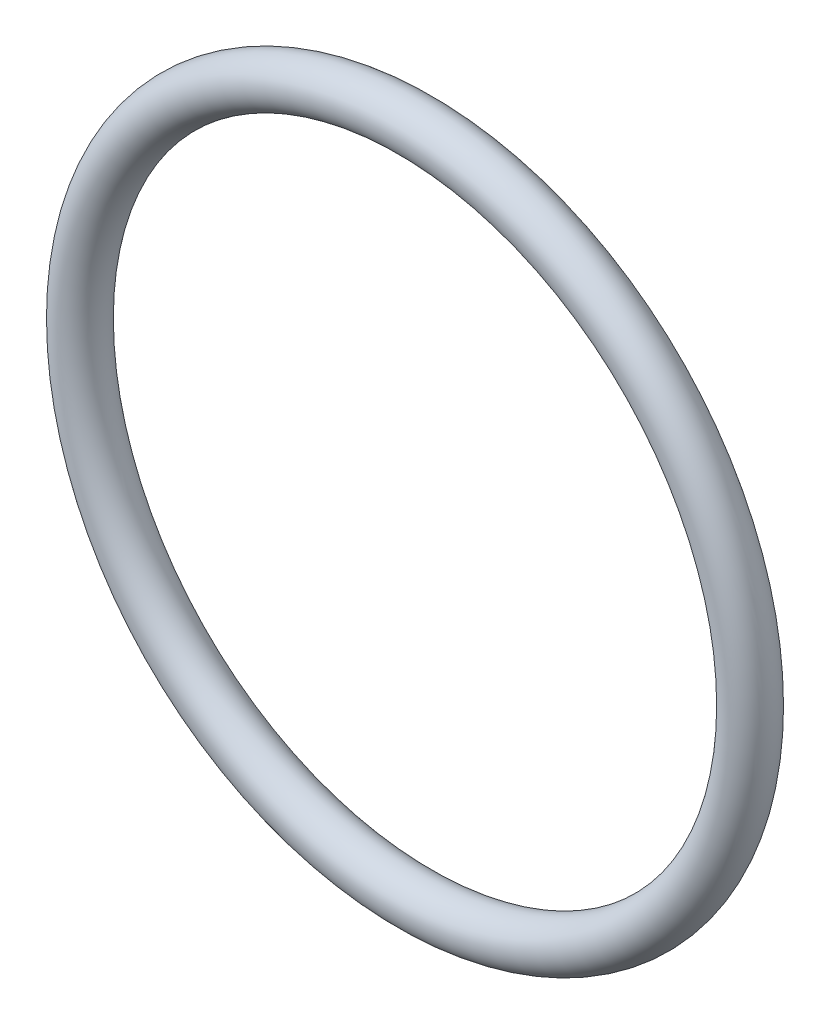
ISO-10303-21;
HEADER;
FILE_DESCRIPTION(('STEP AP214'),'2;1');
FILE_NAME('part.step','',(''),(''),'','','');
FILE_SCHEMA(('AUTOMOTIVE_DESIGN { 1 0 10303 214 1 1 1 1 }'));
ENDSEC;
DATA;
#1=APPLICATION_CONTEXT('core data for automotive mechanical design processes');
#2=APPLICATION_PROTOCOL_DEFINITION('international standard','automotive_design',2000,#1);
#3=PRODUCT_CONTEXT('',#1,'mechanical');
#4=PRODUCT('Part','Part','',(#3));
#5=PRODUCT_RELATED_PRODUCT_CATEGORY('part','',(#4));
#6=PRODUCT_DEFINITION_FORMATION('','',#4);
#7=PRODUCT_DEFINITION_CONTEXT('part definition',#1,'design');
#8=PRODUCT_DEFINITION('design','',#6,#7);
#9=PRODUCT_DEFINITION_SHAPE('','',#8);
#10=(LENGTH_UNIT() NAMED_UNIT(*) SI_UNIT(.MILLI.,.METRE.));
#11=(NAMED_UNIT(*) PLANE_ANGLE_UNIT() SI_UNIT($,.RADIAN.));
#12=(NAMED_UNIT(*) SI_UNIT($,.STERADIAN.) SOLID_ANGLE_UNIT());
#13=UNCERTAINTY_MEASURE_WITH_UNIT(LENGTH_MEASURE(1.E-05),#10,'distance_accuracy_value','');
#14=(GEOMETRIC_REPRESENTATION_CONTEXT(3) GLOBAL_UNCERTAINTY_ASSIGNED_CONTEXT((#13)) GLOBAL_UNIT_ASSIGNED_CONTEXT((#10,
#11,#12)) REPRESENTATION_CONTEXT('',''));
#15=CARTESIAN_POINT('',(0.,0.,0.));
#16=DIRECTION('',(0.,0.,1.));
#17=DIRECTION('',(1.,0.,0.));
#18=AXIS2_PLACEMENT_3D('',#15,#16,#17);
#19=CARTESIAN_POINT('',(0.,0.,0.));
#20=DIRECTION('',(0.,0.,1.));
#21=DIRECTION('',(1.,0.,0.));
#22=AXIS2_PLACEMENT_3D('',#19,#20,#21);
#23=TOROIDAL_SURFACE('',#22,8.5,0.6);
#24=CARTESIAN_POINT('',(8.5,0.,0.));
#25=DIRECTION('',(0.,1.,0.));
#26=DIRECTION('',(-1.,0.,0.));
#27=AXIS2_PLACEMENT_3D('',#24,#25,#26);
#28=CIRCLE('',#27,0.6);
#29=CARTESIAN_POINT('',(9.1,0.,0.));
#30=VERTEX_POINT('',#29);
#31=EDGE_CURVE('E11',#30,#30,#28,.T.);
#32=CARTESIAN_POINT('',(0.,0.,0.));
#33=DIRECTION('',(0.,0.,1.));
#34=DIRECTION('',(1.,0.,0.));
#35=AXIS2_PLACEMENT_3D('',#32,#33,#34);
#36=CIRCLE('',#35,9.1);
#37=EDGE_CURVE('',#30,#30,#36,.T.);
#38=ORIENTED_EDGE('',*,*,#31,.T.);
#39=ORIENTED_EDGE('',*,*,#31,.F.);
#40=ORIENTED_EDGE('',*,*,#37,.T.);
#41=ORIENTED_EDGE('',*,*,#37,.F.);
#42=EDGE_LOOP('',(#38,#40,#39,#41));
#43=FACE_BOUND('',#42,.T.);
#44=ADVANCED_FACE('F52',(#43),#23,.T.);
#45=CLOSED_SHELL('',(#44));
#46=MANIFOLD_SOLID_BREP('B2',#45);
#47=ADVANCED_BREP_SHAPE_REPRESENTATION('',(#18,#46),#14);
#48=SHAPE_DEFINITION_REPRESENTATION(#9,#47);
ENDSEC;
END-ISO-10303-21;
